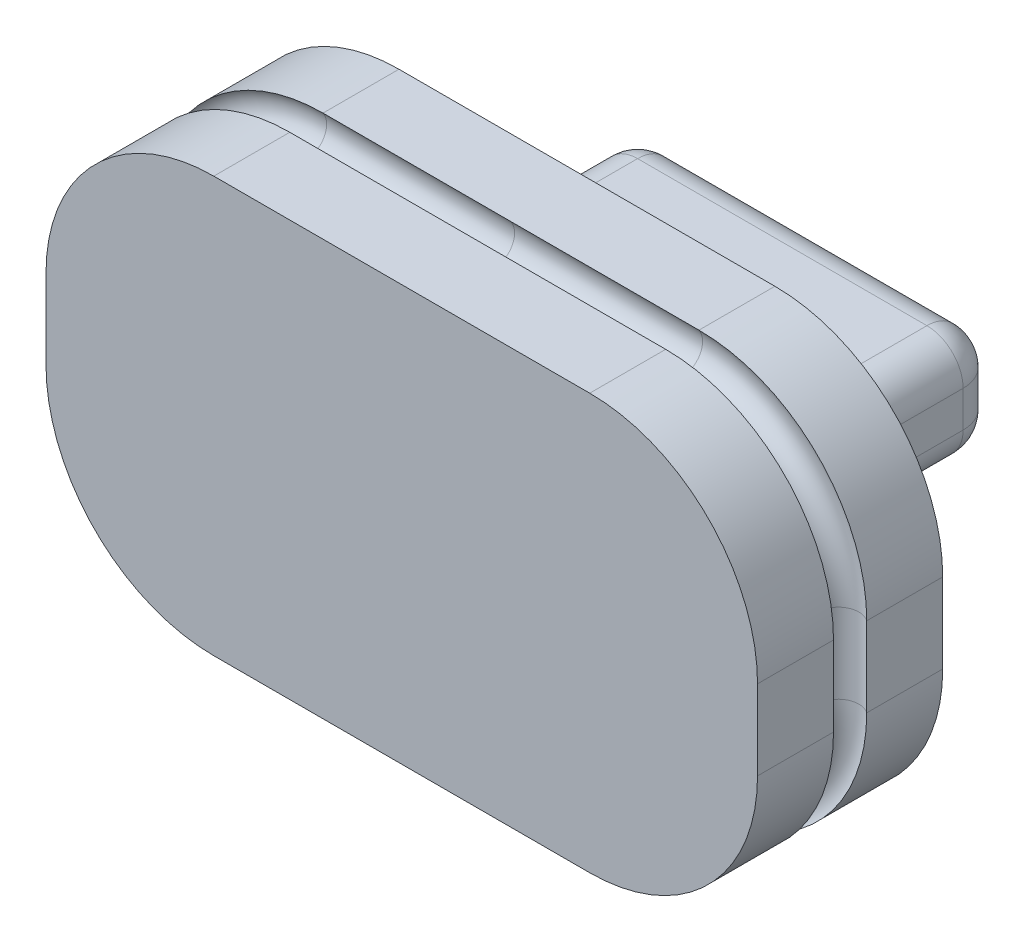
ISO-10303-21;
HEADER;
FILE_DESCRIPTION(('STEP AP214'),'2;1');
FILE_NAME('part.step','',(''),(''),'','','');
FILE_SCHEMA(('AUTOMOTIVE_DESIGN { 1 0 10303 214 1 1 1 1 }'));
ENDSEC;
DATA;
#1=APPLICATION_CONTEXT('core data for automotive mechanical design processes');
#2=APPLICATION_PROTOCOL_DEFINITION('international standard','automotive_design',2000,#1);
#3=PRODUCT_CONTEXT('',#1,'mechanical');
#4=PRODUCT('Part','Part','',(#3));
#5=PRODUCT_RELATED_PRODUCT_CATEGORY('part','',(#4));
#6=PRODUCT_DEFINITION_FORMATION('','',#4);
#7=PRODUCT_DEFINITION_CONTEXT('part definition',#1,'design');
#8=PRODUCT_DEFINITION('design','',#6,#7);
#9=PRODUCT_DEFINITION_SHAPE('','',#8);
#10=(LENGTH_UNIT() NAMED_UNIT(*) SI_UNIT(.MILLI.,.METRE.));
#11=(NAMED_UNIT(*) PLANE_ANGLE_UNIT() SI_UNIT($,.RADIAN.));
#12=(NAMED_UNIT(*) SI_UNIT($,.STERADIAN.) SOLID_ANGLE_UNIT());
#13=UNCERTAINTY_MEASURE_WITH_UNIT(LENGTH_MEASURE(1.E-05),#10,'distance_accuracy_value','');
#14=(GEOMETRIC_REPRESENTATION_CONTEXT(3) GLOBAL_UNCERTAINTY_ASSIGNED_CONTEXT((#13)) GLOBAL_UNIT_ASSIGNED_CONTEXT((#10,
#11,#12)) REPRESENTATION_CONTEXT('',''));
#15=CARTESIAN_POINT('',(0.,0.,0.));
#16=DIRECTION('',(0.,0.,1.));
#17=DIRECTION('',(1.,0.,0.));
#18=AXIS2_PLACEMENT_3D('',#15,#16,#17);
#19=CARTESIAN_POINT('',(-243.375083311208,0.,8.128));
#20=DIRECTION('',(-1.,0.,0.));
#21=DIRECTION('',(0.,0.,1.));
#22=AXIS2_PLACEMENT_3D('',#19,#20,#21);
#23=PLANE('',#22);
#24=DIRECTION('',(0.,-1.,0.));
#25=VECTOR('',#24,1.);
#26=CARTESIAN_POINT('',(-243.375083311208,1536.49490135246,3.33444054388972));
#27=LINE('',#26,#25);
#28=CARTESIAN_POINT('',(-243.375083311207,1536.49490135246,3.33444054388899));
#29=VERTEX_POINT('',#28);
#30=CARTESIAN_POINT('',(-243.375083311208,1532.99490135246,3.33444054388959));
#31=VERTEX_POINT('',#30);
#32=EDGE_CURVE('E11',#29,#31,#27,.T.);
#33=ORIENTED_EDGE('',*,*,#32,.F.);
#34=DIRECTION('',(0.,0.,-1.));
#35=VECTOR('',#34,1.);
#36=CARTESIAN_POINT('',(-243.375083311208,1536.49490135246,8.128));
#37=LINE('',#36,#35);
#38=CARTESIAN_POINT('',(-243.375083311208,1536.49490135246,0.));
#39=VERTEX_POINT('',#38);
#40=EDGE_CURVE('E230',#29,#39,#37,.T.);
#41=ORIENTED_EDGE('',*,*,#40,.T.);
#42=DIRECTION('',(0.,1.,0.));
#43=VECTOR('',#42,1.);
#44=CARTESIAN_POINT('',(-243.375083311208,0.,0.));
#45=LINE('',#44,#43);
#46=CARTESIAN_POINT('',(-243.375083311208,1532.99490135246,0.));
#47=VERTEX_POINT('',#46);
#48=EDGE_CURVE('E380',#47,#39,#45,.T.);
#49=ORIENTED_EDGE('',*,*,#48,.F.);
#50=DIRECTION('',(0.,0.,-1.));
#51=VECTOR('',#50,1.);
#52=CARTESIAN_POINT('',(-243.375083311208,1532.99490135246,8.128));
#53=LINE('',#52,#51);
#54=EDGE_CURVE('E232',#31,#47,#53,.T.);
#55=ORIENTED_EDGE('',*,*,#54,.F.);
#56=EDGE_LOOP('',(#33,#41,#49,#55));
#57=FACE_BOUND('',#56,.T.);
#58=ADVANCED_FACE('F35',(#57),#23,.T.);
#59=CARTESIAN_POINT('',(0.,1525.62990135246,8.128));
#60=DIRECTION('',(0.,-1.,0.));
#61=DIRECTION('',(0.,0.,-1.));
#62=AXIS2_PLACEMENT_3D('',#59,#60,#61);
#63=PLANE('',#62);
#64=DIRECTION('',(1.,0.,0.));
#65=VECTOR('',#64,1.);
#66=CARTESIAN_POINT('',(-236.010083311208,1525.62990135246,3.33444054388964));
#67=LINE('',#66,#65);
#68=CARTESIAN_POINT('',(-236.010083311208,1525.62990135246,3.33444054388964));
#69=VERTEX_POINT('',#68);
#70=CARTESIAN_POINT('',(-219.510083311208,1525.62990135246,3.3344405438896));
#71=VERTEX_POINT('',#70);
#72=EDGE_CURVE('E337',#69,#71,#67,.T.);
#73=ORIENTED_EDGE('',*,*,#72,.F.);
#74=DIRECTION('',(0.,0.,-1.));
#75=VECTOR('',#74,1.);
#76=CARTESIAN_POINT('',(-236.010083311208,1525.62990135246,8.128));
#77=LINE('',#76,#75);
#78=CARTESIAN_POINT('',(-236.010083311208,1525.62990135246,0.));
#79=VERTEX_POINT('',#78);
#80=EDGE_CURVE('E266',#69,#79,#77,.T.);
#81=ORIENTED_EDGE('',*,*,#80,.T.);
#82=DIRECTION('',(-1.,0.,0.));
#83=VECTOR('',#82,1.);
#84=CARTESIAN_POINT('',(0.,1525.62990135246,0.));
#85=LINE('',#84,#83);
#86=CARTESIAN_POINT('',(-219.510083311208,1525.62990135246,0.));
#87=VERTEX_POINT('',#86);
#88=EDGE_CURVE('E371',#87,#79,#85,.T.);
#89=ORIENTED_EDGE('',*,*,#88,.F.);
#90=DIRECTION('',(0.,0.,-1.));
#91=VECTOR('',#90,1.);
#92=CARTESIAN_POINT('',(-219.510083311208,1525.62990135246,8.128));
#93=LINE('',#92,#91);
#94=EDGE_CURVE('E262',#71,#87,#93,.T.);
#95=ORIENTED_EDGE('',*,*,#94,.F.);
#96=EDGE_LOOP('',(#73,#81,#89,#95));
#97=FACE_BOUND('',#96,.T.);
#98=ADVANCED_FACE('F369',(#97),#63,.T.);
#99=CARTESIAN_POINT('',(-212.14508331122,1.68234540037964E-12,8.128));
#100=DIRECTION('',(1.,0.,0.));
#101=DIRECTION('',(0.,1.,0.));
#102=AXIS2_PLACEMENT_3D('',#99,#100,#101);
#103=PLANE('',#102);
#104=DIRECTION('',(0.,1.,0.));
#105=VECTOR('',#104,1.);
#106=CARTESIAN_POINT('',(-212.145083311208,1532.99490135246,3.33444054388962));
#107=LINE('',#106,#105);
#108=CARTESIAN_POINT('',(-212.145083311208,1532.99490135246,3.33444054388962));
#109=VERTEX_POINT('',#108);
#110=CARTESIAN_POINT('',(-212.145083311208,1536.49490135246,3.33444054388967));
#111=VERTEX_POINT('',#110);
#112=EDGE_CURVE('E333',#109,#111,#107,.T.);
#113=ORIENTED_EDGE('',*,*,#112,.F.);
#114=DIRECTION('',(0.,0.,-1.));
#115=VECTOR('',#114,1.);
#116=CARTESIAN_POINT('',(-212.145083311208,1532.99490135246,8.128));
#117=LINE('',#116,#115);
#118=CARTESIAN_POINT('',(-212.145083311208,1532.99490135246,0.));
#119=VERTEX_POINT('',#118);
#120=EDGE_CURVE('E258',#109,#119,#117,.T.);
#121=ORIENTED_EDGE('',*,*,#120,.T.);
#122=DIRECTION('',(0.,-1.,0.));
#123=VECTOR('',#122,1.);
#124=CARTESIAN_POINT('',(-212.14508331122,1.68234540037964E-12,0.));
#125=LINE('',#124,#123);
#126=CARTESIAN_POINT('',(-212.145083311208,1536.49490135246,0.));
#127=VERTEX_POINT('',#126);
#128=EDGE_CURVE('E378',#127,#119,#125,.T.);
#129=ORIENTED_EDGE('',*,*,#128,.F.);
#130=DIRECTION('',(0.,0.,-1.));
#131=VECTOR('',#130,1.);
#132=CARTESIAN_POINT('',(-212.145083311208,1536.49490135246,8.128));
#133=LINE('',#132,#131);
#134=EDGE_CURVE('E254',#111,#127,#133,.T.);
#135=ORIENTED_EDGE('',*,*,#134,.F.);
#136=EDGE_LOOP('',(#113,#121,#129,#135));
#137=FACE_BOUND('',#136,.T.);
#138=ADVANCED_FACE('F607',(#137),#103,.T.);
#139=CARTESIAN_POINT('',(0.,1543.85990135246,8.128));
#140=DIRECTION('',(0.,1.,0.));
#141=DIRECTION('',(0.,0.,1.));
#142=AXIS2_PLACEMENT_3D('',#139,#140,#141);
#143=PLANE('',#142);
#144=DIRECTION('',(-1.,0.,0.));
#145=VECTOR('',#144,1.);
#146=CARTESIAN_POINT('',(-219.510083311208,1543.85990135246,3.33444054388964));
#147=LINE('',#146,#145);
#148=CARTESIAN_POINT('',(-219.510083311208,1543.85990135246,3.33444054388964));
#149=VERTEX_POINT('',#148);
#150=CARTESIAN_POINT('',(-227.760083311208,1543.85990135246,3.33444054388964));
#151=VERTEX_POINT('',#150);
#152=EDGE_CURVE('E329',#149,#151,#147,.T.);
#153=ORIENTED_EDGE('',*,*,#152,.F.);
#154=DIRECTION('',(0.,0.,-1.));
#155=VECTOR('',#154,1.);
#156=CARTESIAN_POINT('',(-219.510083311208,1543.85990135246,8.128));
#157=LINE('',#156,#155);
#158=CARTESIAN_POINT('',(-219.510083311208,1543.85990135246,0.));
#159=VERTEX_POINT('',#158);
#160=EDGE_CURVE('E250',#149,#159,#157,.T.);
#161=ORIENTED_EDGE('',*,*,#160,.T.);
#162=DIRECTION('',(1.,0.,0.));
#163=VECTOR('',#162,1.);
#164=CARTESIAN_POINT('',(0.,1543.85990135246,0.));
#165=LINE('',#164,#163);
#166=CARTESIAN_POINT('',(-236.010083311208,1543.85990135246,0.));
#167=VERTEX_POINT('',#166);
#168=EDGE_CURVE('E388',#167,#159,#165,.T.);
#169=ORIENTED_EDGE('',*,*,#168,.F.);
#170=DIRECTION('',(0.,0.,-1.));
#171=VECTOR('',#170,1.);
#172=CARTESIAN_POINT('',(-236.010083311208,1543.85990135246,8.128));
#173=LINE('',#172,#171);
#174=CARTESIAN_POINT('',(-236.010083311208,1543.85990135246,3.33444054388899));
#175=VERTEX_POINT('',#174);
#176=EDGE_CURVE('E241',#175,#167,#173,.T.);
#177=ORIENTED_EDGE('',*,*,#176,.F.);
#178=DIRECTION('',(-1.,0.,0.));
#179=VECTOR('',#178,1.);
#180=CARTESIAN_POINT('',(-227.760083311208,1543.85990135246,3.33444054388964));
#181=LINE('',#180,#179);
#182=EDGE_CURVE('E327',#151,#175,#181,.T.);
#183=ORIENTED_EDGE('',*,*,#182,.F.);
#184=EDGE_LOOP('',(#153,#161,#169,#177,#183));
#185=FACE_BOUND('',#184,.T.);
#186=ADVANCED_FACE('F526',(#185),#143,.T.);
#187=CARTESIAN_POINT('',(0.,0.,0.));
#188=DIRECTION('',(0.,0.,1.));
#189=DIRECTION('',(1.,0.,0.));
#190=AXIS2_PLACEMENT_3D('',#187,#188,#189);
#191=PLANE('',#190);
#192=ORIENTED_EDGE('',*,*,#48,.T.);
#193=CARTESIAN_POINT('',(-236.010083311208,1536.49490135246,0.));
#194=DIRECTION('',(0.,0.,1.));
#195=DIRECTION('',(1.,0.,0.));
#196=AXIS2_PLACEMENT_3D('',#193,#194,#195);
#197=CIRCLE('',#196,7.36500000000002);
#198=EDGE_CURVE('E235',#167,#39,#197,.T.);
#199=ORIENTED_EDGE('',*,*,#198,.F.);
#200=ORIENTED_EDGE('',*,*,#168,.T.);
#201=CARTESIAN_POINT('',(-219.510083311208,1536.49490135246,0.));
#202=DIRECTION('',(0.,0.,1.));
#203=DIRECTION('',(1.,0.,0.));
#204=AXIS2_PLACEMENT_3D('',#201,#202,#203);
#205=CIRCLE('',#204,7.36500000000002);
#206=EDGE_CURVE('E386',#127,#159,#205,.T.);
#207=ORIENTED_EDGE('',*,*,#206,.F.);
#208=ORIENTED_EDGE('',*,*,#128,.T.);
#209=CARTESIAN_POINT('',(-219.510083311208,1532.99490135246,0.));
#210=DIRECTION('',(0.,0.,1.));
#211=DIRECTION('',(1.,0.,0.));
#212=AXIS2_PLACEMENT_3D('',#209,#210,#211);
#213=CIRCLE('',#212,7.36500000000001);
#214=EDGE_CURVE('E375',#87,#119,#213,.T.);
#215=ORIENTED_EDGE('',*,*,#214,.F.);
#216=ORIENTED_EDGE('',*,*,#88,.T.);
#217=CARTESIAN_POINT('',(-236.010083311208,1532.99490135246,0.));
#218=DIRECTION('',(0.,0.,1.));
#219=DIRECTION('',(1.,0.,0.));
#220=AXIS2_PLACEMENT_3D('',#217,#218,#219);
#221=CIRCLE('',#220,7.36500000000002);
#222=EDGE_CURVE('E376',#47,#79,#221,.T.);
#223=ORIENTED_EDGE('',*,*,#222,.F.);
#224=EDGE_LOOP('',(#192,#199,#200,#207,#208,#215,#216,#223));
#225=FACE_BOUND('',#224,.T.);
#226=CARTESIAN_POINT('',(-221.410083311208,1535.53865135246,0.));
#227=DIRECTION('',(0.,0.,-1.));
#228=DIRECTION('',(-1.,0.,0.));
#229=AXIS2_PLACEMENT_3D('',#226,#227,#228);
#230=CIRCLE('',#229,1.58750000000002);
#231=CARTESIAN_POINT('',(-221.410083311208,1537.12615135246,0.));
#232=VERTEX_POINT('',#231);
#233=CARTESIAN_POINT('',(-219.822583311208,1535.53865135246,0.));
#234=VERTEX_POINT('',#233);
#235=EDGE_CURVE('E320',#232,#234,#230,.T.);
#236=ORIENTED_EDGE('',*,*,#235,.F.);
#237=DIRECTION('',(1.,0.,0.));
#238=VECTOR('',#237,1.);
#239=CARTESIAN_POINT('',(-234.110083311208,1537.12615135246,0.));
#240=LINE('',#239,#238);
#241=CARTESIAN_POINT('',(-234.110083311208,1537.12615135246,0.));
#242=VERTEX_POINT('',#241);
#243=EDGE_CURVE('E436',#242,#232,#240,.T.);
#244=ORIENTED_EDGE('',*,*,#243,.F.);
#245=CARTESIAN_POINT('',(-234.110083311208,1535.53865135246,0.));
#246=DIRECTION('',(0.,0.,-1.));
#247=DIRECTION('',(-1.,0.,0.));
#248=AXIS2_PLACEMENT_3D('',#245,#246,#247);
#249=CIRCLE('',#248,1.58750000000002);
#250=CARTESIAN_POINT('',(-235.697583311208,1535.53865135246,0.));
#251=VERTEX_POINT('',#250);
#252=EDGE_CURVE('E439',#251,#242,#249,.T.);
#253=ORIENTED_EDGE('',*,*,#252,.F.);
#254=DIRECTION('',(0.,1.,0.));
#255=VECTOR('',#254,1.);
#256=CARTESIAN_POINT('',(-235.697583311208,1533.95115135246,0.));
#257=LINE('',#256,#255);
#258=CARTESIAN_POINT('',(-235.697583311208,1533.95115135246,0.));
#259=VERTEX_POINT('',#258);
#260=EDGE_CURVE('E442',#259,#251,#257,.T.);
#261=ORIENTED_EDGE('',*,*,#260,.F.);
#262=CARTESIAN_POINT('',(-234.110083311208,1533.95115135246,0.));
#263=DIRECTION('',(0.,0.,-1.));
#264=DIRECTION('',(-1.,0.,0.));
#265=AXIS2_PLACEMENT_3D('',#262,#263,#264);
#266=CIRCLE('',#265,1.58750000000002);
#267=CARTESIAN_POINT('',(-234.110083311208,1532.36365135246,0.));
#268=VERTEX_POINT('',#267);
#269=EDGE_CURVE('E445',#268,#259,#266,.T.);
#270=ORIENTED_EDGE('',*,*,#269,.F.);
#271=DIRECTION('',(-1.,0.,0.));
#272=VECTOR('',#271,1.);
#273=CARTESIAN_POINT('',(-234.110083311208,1532.36365135246,0.));
#274=LINE('',#273,#272);
#275=CARTESIAN_POINT('',(-221.410083311208,1532.36365135246,0.));
#276=VERTEX_POINT('',#275);
#277=EDGE_CURVE('E448',#276,#268,#274,.T.);
#278=ORIENTED_EDGE('',*,*,#277,.F.);
#279=CARTESIAN_POINT('',(-221.410083311208,1533.95115135246,0.));
#280=DIRECTION('',(0.,0.,-1.));
#281=DIRECTION('',(1.,0.,0.));
#282=AXIS2_PLACEMENT_3D('',#279,#280,#281);
#283=CIRCLE('',#282,1.58750000000002);
#284=CARTESIAN_POINT('',(-219.822583311208,1533.95115135246,0.));
#285=VERTEX_POINT('',#284);
#286=EDGE_CURVE('E451',#285,#276,#283,.T.);
#287=ORIENTED_EDGE('',*,*,#286,.F.);
#288=DIRECTION('',(0.,-1.,0.));
#289=VECTOR('',#288,1.);
#290=CARTESIAN_POINT('',(-219.822583311208,1533.95115135246,0.));
#291=LINE('',#290,#289);
#292=EDGE_CURVE('E453',#234,#285,#291,.T.);
#293=ORIENTED_EDGE('',*,*,#292,.F.);
#294=EDGE_LOOP('',(#236,#244,#253,#261,#270,#278,#287,#293));
#295=FACE_BOUND('',#294,.T.);
#296=ADVANCED_FACE('F528',(#225,#295),#191,.F.);
#297=CARTESIAN_POINT('',(-236.010083311208,1532.99490135246,8.128));
#298=DIRECTION('',(0.,0.,-1.));
#299=DIRECTION('',(-1.,0.,0.));
#300=AXIS2_PLACEMENT_3D('',#297,#298,#299);
#301=CYLINDRICAL_SURFACE('',#300,7.36500000000002);
#302=ORIENTED_EDGE('',*,*,#80,.F.);
#303=CARTESIAN_POINT('',(-236.010083311208,1532.99490135246,3.33444054388959));
#304=DIRECTION('',(0.,0.,1.));
#305=DIRECTION('',(1.,0.,0.));
#306=AXIS2_PLACEMENT_3D('',#303,#304,#305);
#307=CIRCLE('',#306,7.36500000000002);
#308=EDGE_CURVE('E459',#69,#31,#307,.F.);
#309=ORIENTED_EDGE('',*,*,#308,.T.);
#310=ORIENTED_EDGE('',*,*,#54,.T.);
#311=ORIENTED_EDGE('',*,*,#222,.T.);
#312=EDGE_LOOP('',(#302,#309,#310,#311));
#313=FACE_BOUND('',#312,.T.);
#314=ADVANCED_FACE('F531',(#313),#301,.T.);
#315=CARTESIAN_POINT('',(-219.510083311208,1532.99490135246,8.128));
#316=DIRECTION('',(0.,0.,-1.));
#317=DIRECTION('',(-1.,0.,0.));
#318=AXIS2_PLACEMENT_3D('',#315,#316,#317);
#319=CYLINDRICAL_SURFACE('',#318,7.36500000000001);
#320=ORIENTED_EDGE('',*,*,#120,.F.);
#321=CARTESIAN_POINT('',(-219.510083311208,1532.99490135246,3.3344405438896));
#322=DIRECTION('',(0.,0.,1.));
#323=DIRECTION('',(1.,0.,0.));
#324=AXIS2_PLACEMENT_3D('',#321,#322,#323);
#325=CIRCLE('',#324,7.36500000000001);
#326=EDGE_CURVE('E355',#109,#71,#325,.F.);
#327=ORIENTED_EDGE('',*,*,#326,.T.);
#328=ORIENTED_EDGE('',*,*,#94,.T.);
#329=ORIENTED_EDGE('',*,*,#214,.T.);
#330=EDGE_LOOP('',(#320,#327,#328,#329));
#331=FACE_BOUND('',#330,.T.);
#332=ADVANCED_FACE('F363',(#331),#319,.T.);
#333=CARTESIAN_POINT('',(-219.510083311208,1536.49490135246,8.128));
#334=DIRECTION('',(0.,0.,-1.));
#335=DIRECTION('',(-1.,0.,0.));
#336=AXIS2_PLACEMENT_3D('',#333,#334,#335);
#337=CYLINDRICAL_SURFACE('',#336,7.36500000000002);
#338=ORIENTED_EDGE('',*,*,#160,.F.);
#339=CARTESIAN_POINT('',(-219.510083311208,1536.49490135246,3.33444054388967));
#340=DIRECTION('',(0.,0.,1.));
#341=DIRECTION('',(1.,0.,0.));
#342=AXIS2_PLACEMENT_3D('',#339,#340,#341);
#343=CIRCLE('',#342,7.36500000000002);
#344=EDGE_CURVE('E465',#149,#111,#343,.F.);
#345=ORIENTED_EDGE('',*,*,#344,.T.);
#346=ORIENTED_EDGE('',*,*,#134,.T.);
#347=ORIENTED_EDGE('',*,*,#206,.T.);
#348=EDGE_LOOP('',(#338,#345,#346,#347));
#349=FACE_BOUND('',#348,.T.);
#350=ADVANCED_FACE('F599',(#349),#337,.T.);
#351=CARTESIAN_POINT('',(-236.010083311208,1536.49490135246,8.128));
#352=DIRECTION('',(0.,0.,-1.));
#353=DIRECTION('',(-1.,0.,0.));
#354=AXIS2_PLACEMENT_3D('',#351,#352,#353);
#355=CYLINDRICAL_SURFACE('',#354,7.36500000000002);
#356=ORIENTED_EDGE('',*,*,#40,.F.);
#357=CARTESIAN_POINT('',(-236.010083311208,1536.49490135246,3.33444054388899));
#358=DIRECTION('',(0.,0.,1.));
#359=DIRECTION('',(1.,0.,0.));
#360=AXIS2_PLACEMENT_3D('',#357,#358,#359);
#361=CIRCLE('',#360,7.36500000000002);
#362=EDGE_CURVE('E210',#29,#175,#361,.F.);
#363=ORIENTED_EDGE('',*,*,#362,.T.);
#364=ORIENTED_EDGE('',*,*,#176,.T.);
#365=ORIENTED_EDGE('',*,*,#198,.T.);
#366=EDGE_LOOP('',(#356,#363,#364,#365));
#367=FACE_BOUND('',#366,.T.);
#368=ADVANCED_FACE('F233',(#367),#355,.T.);
#369=CARTESIAN_POINT('',(-221.410083311208,1535.53865135246,-10.16));
#370=DIRECTION('',(0.,0.,1.));
#371=DIRECTION('',(1.,0.,0.));
#372=AXIS2_PLACEMENT_3D('',#369,#370,#371);
#373=CYLINDRICAL_SURFACE('',#372,1.58750000000002);
#374=DIRECTION('',(0.,0.,1.));
#375=VECTOR('',#374,1.);
#376=CARTESIAN_POINT('',(-219.822583311208,1535.53865135246,-10.16));
#377=LINE('',#376,#375);
#378=CARTESIAN_POINT('',(-219.822583311208,1535.53865135246,-8.5725));
#379=VERTEX_POINT('',#378);
#380=EDGE_CURVE('E401',#379,#234,#377,.T.);
#381=ORIENTED_EDGE('',*,*,#380,.F.);
#382=CARTESIAN_POINT('',(-221.410083311208,1535.53865135246,-8.5725));
#383=DIRECTION('',(0.,0.,1.));
#384=DIRECTION('',(1.,0.,0.));
#385=AXIS2_PLACEMENT_3D('',#382,#383,#384);
#386=CIRCLE('',#385,1.58750000000002);
#387=CARTESIAN_POINT('',(-221.410083311208,1537.12615135246,-8.5725));
#388=VERTEX_POINT('',#387);
#389=EDGE_CURVE('E216',#379,#388,#386,.T.);
#390=ORIENTED_EDGE('',*,*,#389,.T.);
#391=DIRECTION('',(0.,0.,1.));
#392=VECTOR('',#391,1.);
#393=CARTESIAN_POINT('',(-221.410083311208,1537.12615135246,-10.16));
#394=LINE('',#393,#392);
#395=EDGE_CURVE('E434',#388,#232,#394,.T.);
#396=ORIENTED_EDGE('',*,*,#395,.T.);
#397=ORIENTED_EDGE('',*,*,#235,.T.);
#398=EDGE_LOOP('',(#381,#390,#396,#397));
#399=FACE_BOUND('',#398,.T.);
#400=ADVANCED_FACE('F591',(#399),#373,.T.);
#401=CARTESIAN_POINT('',(-219.822583311208,1533.95115135246,-10.16));
#402=DIRECTION('',(-1.,0.,0.));
#403=DIRECTION('',(0.,0.,1.));
#404=AXIS2_PLACEMENT_3D('',#401,#402,#403);
#405=PLANE('',#404);
#406=DIRECTION('',(0.,0.,1.));
#407=VECTOR('',#406,1.);
#408=CARTESIAN_POINT('',(-219.822583311208,1533.95115135246,-10.16));
#409=LINE('',#408,#407);
#410=CARTESIAN_POINT('',(-219.822583311208,1533.95115135246,-8.5725));
#411=VERTEX_POINT('',#410);
#412=EDGE_CURVE('E414',#411,#285,#409,.T.);
#413=ORIENTED_EDGE('',*,*,#412,.F.);
#414=DIRECTION('',(0.,-1.,0.));
#415=VECTOR('',#414,1.);
#416=CARTESIAN_POINT('',(-219.822583311208,1535.53865135246,-8.5725));
#417=LINE('',#416,#415);
#418=EDGE_CURVE('E295',#411,#379,#417,.F.);
#419=ORIENTED_EDGE('',*,*,#418,.T.);
#420=ORIENTED_EDGE('',*,*,#380,.T.);
#421=ORIENTED_EDGE('',*,*,#292,.T.);
#422=EDGE_LOOP('',(#413,#419,#420,#421));
#423=FACE_BOUND('',#422,.T.);
#424=ADVANCED_FACE('F579',(#423),#405,.F.);
#425=CARTESIAN_POINT('',(-221.410083311208,1533.95115135246,-10.16));
#426=DIRECTION('',(0.,0.,1.));
#427=DIRECTION('',(1.,0.,0.));
#428=AXIS2_PLACEMENT_3D('',#425,#426,#427);
#429=CYLINDRICAL_SURFACE('',#428,1.58750000000002);
#430=DIRECTION('',(0.,0.,1.));
#431=VECTOR('',#430,1.);
#432=CARTESIAN_POINT('',(-221.410083311208,1532.36365135246,-10.16));
#433=LINE('',#432,#431);
#434=CARTESIAN_POINT('',(-221.410083311208,1532.36365135246,-8.5725));
#435=VERTEX_POINT('',#434);
#436=EDGE_CURVE('E419',#435,#276,#433,.T.);
#437=ORIENTED_EDGE('',*,*,#436,.F.);
#438=CARTESIAN_POINT('',(-221.410083311208,1533.95115135246,-8.5725));
#439=DIRECTION('',(0.,0.,1.));
#440=DIRECTION('',(1.,0.,0.));
#441=AXIS2_PLACEMENT_3D('',#438,#439,#440);
#442=CIRCLE('',#441,1.58750000000002);
#443=EDGE_CURVE('E293',#435,#411,#442,.T.);
#444=ORIENTED_EDGE('',*,*,#443,.T.);
#445=ORIENTED_EDGE('',*,*,#412,.T.);
#446=ORIENTED_EDGE('',*,*,#286,.T.);
#447=EDGE_LOOP('',(#437,#444,#445,#446));
#448=FACE_BOUND('',#447,.T.);
#449=ADVANCED_FACE('F578',(#448),#429,.T.);
#450=CARTESIAN_POINT('',(-234.110083311208,1532.36365135246,-10.16));
#451=DIRECTION('',(0.,1.,0.));
#452=DIRECTION('',(0.,0.,1.));
#453=AXIS2_PLACEMENT_3D('',#450,#451,#452);
#454=PLANE('',#453);
#455=DIRECTION('',(0.,0.,1.));
#456=VECTOR('',#455,1.);
#457=CARTESIAN_POINT('',(-234.110083311208,1532.36365135246,-10.16));
#458=LINE('',#457,#456);
#459=CARTESIAN_POINT('',(-234.110083311208,1532.36365135246,-8.5725));
#460=VERTEX_POINT('',#459);
#461=EDGE_CURVE('E424',#460,#268,#458,.T.);
#462=ORIENTED_EDGE('',*,*,#461,.F.);
#463=DIRECTION('',(-1.,0.,0.));
#464=VECTOR('',#463,1.);
#465=CARTESIAN_POINT('',(-221.410083311208,1532.36365135246,-8.5725));
#466=LINE('',#465,#464);
#467=EDGE_CURVE('E291',#460,#435,#466,.F.);
#468=ORIENTED_EDGE('',*,*,#467,.T.);
#469=ORIENTED_EDGE('',*,*,#436,.T.);
#470=ORIENTED_EDGE('',*,*,#277,.T.);
#471=EDGE_LOOP('',(#462,#468,#469,#470));
#472=FACE_BOUND('',#471,.T.);
#473=ADVANCED_FACE('F576',(#472),#454,.F.);
#474=CARTESIAN_POINT('',(-234.110083311208,1533.95115135246,-10.16));
#475=DIRECTION('',(0.,0.,1.));
#476=DIRECTION('',(1.,0.,0.));
#477=AXIS2_PLACEMENT_3D('',#474,#475,#476);
#478=CYLINDRICAL_SURFACE('',#477,1.58750000000002);
#479=DIRECTION('',(0.,0.,1.));
#480=VECTOR('',#479,1.);
#481=CARTESIAN_POINT('',(-235.697583311208,1533.95115135246,-10.16));
#482=LINE('',#481,#480);
#483=CARTESIAN_POINT('',(-235.697583311208,1533.95115135246,-8.5725));
#484=VERTEX_POINT('',#483);
#485=EDGE_CURVE('E428',#484,#259,#482,.T.);
#486=ORIENTED_EDGE('',*,*,#485,.F.);
#487=CARTESIAN_POINT('',(-234.110083311208,1533.95115135246,-8.5725));
#488=DIRECTION('',(0.,0.,1.));
#489=DIRECTION('',(1.,0.,0.));
#490=AXIS2_PLACEMENT_3D('',#487,#488,#489);
#491=CIRCLE('',#490,1.58750000000002);
#492=EDGE_CURVE('E289',#484,#460,#491,.T.);
#493=ORIENTED_EDGE('',*,*,#492,.T.);
#494=ORIENTED_EDGE('',*,*,#461,.T.);
#495=ORIENTED_EDGE('',*,*,#269,.T.);
#496=EDGE_LOOP('',(#486,#493,#494,#495));
#497=FACE_BOUND('',#496,.T.);
#498=ADVANCED_FACE('F554',(#497),#478,.T.);
#499=CARTESIAN_POINT('',(-235.697583311208,1533.95115135246,-10.16));
#500=DIRECTION('',(1.,0.,0.));
#501=DIRECTION('',(0.,0.,-1.));
#502=AXIS2_PLACEMENT_3D('',#499,#500,#501);
#503=PLANE('',#502);
#504=DIRECTION('',(0.,0.,1.));
#505=VECTOR('',#504,1.);
#506=CARTESIAN_POINT('',(-235.697583311208,1535.53865135246,-10.16));
#507=LINE('',#506,#505);
#508=CARTESIAN_POINT('',(-235.697583311208,1535.53865135246,-8.5725));
#509=VERTEX_POINT('',#508);
#510=EDGE_CURVE('E430',#509,#251,#507,.T.);
#511=ORIENTED_EDGE('',*,*,#510,.F.);
#512=DIRECTION('',(0.,1.,0.));
#513=VECTOR('',#512,1.);
#514=CARTESIAN_POINT('',(-235.697583311208,1533.95115135246,-8.5725));
#515=LINE('',#514,#513);
#516=EDGE_CURVE('E287',#509,#484,#515,.F.);
#517=ORIENTED_EDGE('',*,*,#516,.T.);
#518=ORIENTED_EDGE('',*,*,#485,.T.);
#519=ORIENTED_EDGE('',*,*,#260,.T.);
#520=EDGE_LOOP('',(#511,#517,#518,#519));
#521=FACE_BOUND('',#520,.T.);
#522=ADVANCED_FACE('F549',(#521),#503,.F.);
#523=CARTESIAN_POINT('',(-234.110083311208,1535.53865135246,-10.16));
#524=DIRECTION('',(0.,0.,1.));
#525=DIRECTION('',(1.,0.,0.));
#526=AXIS2_PLACEMENT_3D('',#523,#524,#525);
#527=CYLINDRICAL_SURFACE('',#526,1.58750000000002);
#528=DIRECTION('',(0.,0.,1.));
#529=VECTOR('',#528,1.);
#530=CARTESIAN_POINT('',(-234.110083311208,1537.12615135246,-10.16));
#531=LINE('',#530,#529);
#532=CARTESIAN_POINT('',(-234.110083311208,1537.12615135246,-8.5725));
#533=VERTEX_POINT('',#532);
#534=EDGE_CURVE('E432',#533,#242,#531,.T.);
#535=ORIENTED_EDGE('',*,*,#534,.F.);
#536=CARTESIAN_POINT('',(-234.110083311208,1535.53865135246,-8.5725));
#537=DIRECTION('',(0.,0.,1.));
#538=DIRECTION('',(1.,0.,0.));
#539=AXIS2_PLACEMENT_3D('',#536,#537,#538);
#540=CIRCLE('',#539,1.58750000000002);
#541=EDGE_CURVE('E285',#533,#509,#540,.T.);
#542=ORIENTED_EDGE('',*,*,#541,.T.);
#543=ORIENTED_EDGE('',*,*,#510,.T.);
#544=ORIENTED_EDGE('',*,*,#252,.T.);
#545=EDGE_LOOP('',(#535,#542,#543,#544));
#546=FACE_BOUND('',#545,.T.);
#547=ADVANCED_FACE('F543',(#546),#527,.T.);
#548=CARTESIAN_POINT('',(-234.110083311208,1537.12615135246,-10.16));
#549=DIRECTION('',(0.,-1.,0.));
#550=DIRECTION('',(0.,0.,-1.));
#551=AXIS2_PLACEMENT_3D('',#548,#549,#550);
#552=PLANE('',#551);
#553=ORIENTED_EDGE('',*,*,#395,.F.);
#554=DIRECTION('',(1.,0.,0.));
#555=VECTOR('',#554,1.);
#556=CARTESIAN_POINT('',(-234.110083311208,1537.12615135246,-8.5725));
#557=LINE('',#556,#555);
#558=EDGE_CURVE('E282',#388,#533,#557,.F.);
#559=ORIENTED_EDGE('',*,*,#558,.T.);
#560=ORIENTED_EDGE('',*,*,#534,.T.);
#561=ORIENTED_EDGE('',*,*,#243,.T.);
#562=EDGE_LOOP('',(#553,#559,#560,#561));
#563=FACE_BOUND('',#562,.T.);
#564=ADVANCED_FACE('F539',(#563),#552,.F.);
#565=CARTESIAN_POINT('',(-221.410083311208,1535.53865135246,-10.16));
#566=DIRECTION('',(0.,0.,-1.));
#567=DIRECTION('',(-1.,0.,0.));
#568=AXIS2_PLACEMENT_3D('',#565,#566,#567);
#569=PLANE('',#568);
#570=DIRECTION('',(0.,1.,0.));
#571=VECTOR('',#570,1.);
#572=CARTESIAN_POINT('',(-234.110083311208,1535.53865135246,-10.16));
#573=LINE('',#572,#571);
#574=CARTESIAN_POINT('',(-234.110083311208,1533.95115135246,-10.16));
#575=VERTEX_POINT('',#574);
#576=CARTESIAN_POINT('',(-234.110083311208,1535.53865135246,-10.16));
#577=VERTEX_POINT('',#576);
#578=EDGE_CURVE('E277',#575,#577,#573,.T.);
#579=ORIENTED_EDGE('',*,*,#578,.T.);
#580=DIRECTION('',(1.,0.,0.));
#581=VECTOR('',#580,1.);
#582=CARTESIAN_POINT('',(-221.410083311208,1535.53865135246,-10.16));
#583=LINE('',#582,#581);
#584=CARTESIAN_POINT('',(-221.410083311208,1535.53865135246,-10.16));
#585=VERTEX_POINT('',#584);
#586=EDGE_CURVE('E279',#577,#585,#583,.T.);
#587=ORIENTED_EDGE('',*,*,#586,.T.);
#588=DIRECTION('',(0.,-1.,0.));
#589=VECTOR('',#588,1.);
#590=CARTESIAN_POINT('',(-221.410083311208,1533.95115135246,-10.16));
#591=LINE('',#590,#589);
#592=CARTESIAN_POINT('',(-221.410083311208,1533.95115135246,-10.16));
#593=VERTEX_POINT('',#592);
#594=EDGE_CURVE('E273',#585,#593,#591,.T.);
#595=ORIENTED_EDGE('',*,*,#594,.T.);
#596=DIRECTION('',(-1.,0.,0.));
#597=VECTOR('',#596,1.);
#598=CARTESIAN_POINT('',(-234.110083311208,1533.95115135246,-10.16));
#599=LINE('',#598,#597);
#600=EDGE_CURVE('E275',#593,#575,#599,.T.);
#601=ORIENTED_EDGE('',*,*,#600,.T.);
#602=EDGE_LOOP('',(#579,#587,#595,#601));
#603=FACE_BOUND('',#602,.T.);
#604=ADVANCED_FACE('F566',(#603),#569,.T.);
#605=CARTESIAN_POINT('',(-221.410083311208,1533.95115135246,-8.5725));
#606=DIRECTION('',(1.,0.,0.));
#607=DIRECTION('',(0.,0.,-1.));
#608=AXIS2_PLACEMENT_3D('',#605,#606,#607);
#609=CYLINDRICAL_SURFACE('',#608,1.5875);
#610=CARTESIAN_POINT('',(-221.410083311208,1533.95115135246,-8.5725));
#611=DIRECTION('',(1.,0.,0.));
#612=DIRECTION('',(0.,0.,-1.));
#613=AXIS2_PLACEMENT_3D('',#610,#611,#612);
#614=CIRCLE('',#613,1.5875);
#615=EDGE_CURVE('E315',#435,#593,#614,.T.);
#616=ORIENTED_EDGE('',*,*,#615,.F.);
#617=ORIENTED_EDGE('',*,*,#467,.F.);
#618=CARTESIAN_POINT('',(-234.110083311208,1533.95115135246,-8.5725));
#619=DIRECTION('',(-1.,0.,0.));
#620=DIRECTION('',(0.,0.,1.));
#621=AXIS2_PLACEMENT_3D('',#618,#619,#620);
#622=CIRCLE('',#621,1.5875);
#623=EDGE_CURVE('E318',#575,#460,#622,.T.);
#624=ORIENTED_EDGE('',*,*,#623,.F.);
#625=ORIENTED_EDGE('',*,*,#600,.F.);
#626=EDGE_LOOP('',(#616,#617,#624,#625));
#627=FACE_BOUND('',#626,.T.);
#628=ADVANCED_FACE('F37',(#627),#609,.T.);
#629=CARTESIAN_POINT('',(-234.110083311208,1533.95115135246,-8.5725));
#630=DIRECTION('',(0.,0.,-1.));
#631=DIRECTION('',(-1.,0.,0.));
#632=AXIS2_PLACEMENT_3D('',#629,#630,#631);
#633=SPHERICAL_SURFACE('',#632,1.5875);
#634=ORIENTED_EDGE('',*,*,#623,.T.);
#635=ORIENTED_EDGE('',*,*,#492,.F.);
#636=CARTESIAN_POINT('',(-234.110083311208,1533.95115135246,-8.5725));
#637=DIRECTION('',(0.,1.,0.));
#638=DIRECTION('',(0.,0.,1.));
#639=AXIS2_PLACEMENT_3D('',#636,#637,#638);
#640=CIRCLE('',#639,1.5875);
#641=EDGE_CURVE('E312',#575,#484,#640,.T.);
#642=ORIENTED_EDGE('',*,*,#641,.F.);
#643=EDGE_LOOP('',(#634,#635,#642));
#644=FACE_BOUND('',#643,.T.);
#645=ADVANCED_FACE('F558',(#644),#633,.T.);
#646=CARTESIAN_POINT('',(-221.410083311208,1533.95115135246,-8.5725));
#647=DIRECTION('',(0.,0.,-1.));
#648=DIRECTION('',(-1.,0.,0.));
#649=AXIS2_PLACEMENT_3D('',#646,#647,#648);
#650=SPHERICAL_SURFACE('',#649,1.5875);
#651=ORIENTED_EDGE('',*,*,#443,.F.);
#652=ORIENTED_EDGE('',*,*,#615,.T.);
#653=CARTESIAN_POINT('',(-221.410083311208,1533.95115135246,-8.5725));
#654=DIRECTION('',(0.,1.,0.));
#655=DIRECTION('',(0.,0.,1.));
#656=AXIS2_PLACEMENT_3D('',#653,#654,#655);
#657=CIRCLE('',#656,1.5875);
#658=EDGE_CURVE('E309',#411,#593,#657,.T.);
#659=ORIENTED_EDGE('',*,*,#658,.F.);
#660=EDGE_LOOP('',(#651,#652,#659));
#661=FACE_BOUND('',#660,.T.);
#662=ADVANCED_FACE('F583',(#661),#650,.T.);
#663=CARTESIAN_POINT('',(-234.110083311208,1535.53865135246,-8.5725));
#664=DIRECTION('',(0.,-1.,0.));
#665=DIRECTION('',(0.,0.,-1.));
#666=AXIS2_PLACEMENT_3D('',#663,#664,#665);
#667=CYLINDRICAL_SURFACE('',#666,1.5875);
#668=ORIENTED_EDGE('',*,*,#641,.T.);
#669=ORIENTED_EDGE('',*,*,#516,.F.);
#670=CARTESIAN_POINT('',(-234.110083311208,1535.53865135246,-8.5725));
#671=DIRECTION('',(0.,1.,0.));
#672=DIRECTION('',(0.,0.,1.));
#673=AXIS2_PLACEMENT_3D('',#670,#671,#672);
#674=CIRCLE('',#673,1.5875);
#675=EDGE_CURVE('E306',#577,#509,#674,.T.);
#676=ORIENTED_EDGE('',*,*,#675,.F.);
#677=ORIENTED_EDGE('',*,*,#578,.F.);
#678=EDGE_LOOP('',(#668,#669,#676,#677));
#679=FACE_BOUND('',#678,.T.);
#680=ADVANCED_FACE('F562',(#679),#667,.T.);
#681=CARTESIAN_POINT('',(-221.410083311208,1535.53865135246,-8.5725));
#682=DIRECTION('',(0.,1.,0.));
#683=DIRECTION('',(0.,0.,1.));
#684=AXIS2_PLACEMENT_3D('',#681,#682,#683);
#685=CYLINDRICAL_SURFACE('',#684,1.5875);
#686=ORIENTED_EDGE('',*,*,#658,.T.);
#687=ORIENTED_EDGE('',*,*,#594,.F.);
#688=CARTESIAN_POINT('',(-221.410083311208,1535.53865135246,-8.5725));
#689=DIRECTION('',(0.,1.,0.));
#690=DIRECTION('',(0.,0.,1.));
#691=AXIS2_PLACEMENT_3D('',#688,#689,#690);
#692=CIRCLE('',#691,1.5875);
#693=EDGE_CURVE('E303',#379,#585,#692,.T.);
#694=ORIENTED_EDGE('',*,*,#693,.F.);
#695=ORIENTED_EDGE('',*,*,#418,.F.);
#696=EDGE_LOOP('',(#686,#687,#694,#695));
#697=FACE_BOUND('',#696,.T.);
#698=ADVANCED_FACE('F586',(#697),#685,.T.);
#699=CARTESIAN_POINT('',(-234.110083311208,1535.53865135246,-8.5725));
#700=DIRECTION('',(0.,0.,-1.));
#701=DIRECTION('',(-1.,0.,0.));
#702=AXIS2_PLACEMENT_3D('',#699,#700,#701);
#703=SPHERICAL_SURFACE('',#702,1.5875);
#704=ORIENTED_EDGE('',*,*,#675,.T.);
#705=ORIENTED_EDGE('',*,*,#541,.F.);
#706=CARTESIAN_POINT('',(-234.110083311208,1535.53865135246,-8.5725));
#707=DIRECTION('',(1.,0.,0.));
#708=DIRECTION('',(0.,0.,-1.));
#709=AXIS2_PLACEMENT_3D('',#706,#707,#708);
#710=CIRCLE('',#709,1.5875);
#711=EDGE_CURVE('E300',#577,#533,#710,.T.);
#712=ORIENTED_EDGE('',*,*,#711,.F.);
#713=EDGE_LOOP('',(#704,#705,#712));
#714=FACE_BOUND('',#713,.T.);
#715=ADVANCED_FACE('F749',(#714),#703,.T.);
#716=CARTESIAN_POINT('',(-221.410083311208,1535.53865135246,-8.5725));
#717=DIRECTION('',(0.,0.,-1.));
#718=DIRECTION('',(-1.,0.,0.));
#719=AXIS2_PLACEMENT_3D('',#716,#717,#718);
#720=SPHERICAL_SURFACE('',#719,1.5875);
#721=ORIENTED_EDGE('',*,*,#389,.F.);
#722=ORIENTED_EDGE('',*,*,#693,.T.);
#723=CARTESIAN_POINT('',(-221.410083311208,1535.53865135246,-8.5725));
#724=DIRECTION('',(-1.,0.,0.));
#725=DIRECTION('',(0.,0.,1.));
#726=AXIS2_PLACEMENT_3D('',#723,#724,#725);
#727=CIRCLE('',#726,1.5875);
#728=EDGE_CURVE('E298',#388,#585,#727,.T.);
#729=ORIENTED_EDGE('',*,*,#728,.F.);
#730=EDGE_LOOP('',(#721,#722,#729));
#731=FACE_BOUND('',#730,.T.);
#732=ADVANCED_FACE('F590',(#731),#720,.T.);
#733=CARTESIAN_POINT('',(-221.410083311208,1535.53865135246,-8.5725));
#734=DIRECTION('',(-1.,0.,0.));
#735=DIRECTION('',(0.,0.,1.));
#736=AXIS2_PLACEMENT_3D('',#733,#734,#735);
#737=CYLINDRICAL_SURFACE('',#736,1.5875);
#738=ORIENTED_EDGE('',*,*,#711,.T.);
#739=ORIENTED_EDGE('',*,*,#558,.F.);
#740=ORIENTED_EDGE('',*,*,#728,.T.);
#741=ORIENTED_EDGE('',*,*,#586,.F.);
#742=EDGE_LOOP('',(#738,#739,#740,#741));
#743=FACE_BOUND('',#742,.T.);
#744=ADVANCED_FACE('F669',(#743),#737,.T.);
#745=CARTESIAN_POINT('',(-236.010083311208,1532.99490135246,4.064));
#746=DIRECTION('',(0.,0.,1.));
#747=DIRECTION('',(1.,0.,0.));
#748=AXIS2_PLACEMENT_3D('',#745,#746,#747);
#749=TOROIDAL_SURFACE('',#748,6.85699999999992,0.889000000000125);
#750=CARTESIAN_POINT('',(-242.867083311207,1532.99490135246,4.064));
#751=DIRECTION('',(0.,-1.,0.));
#752=DIRECTION('',(1.,0.,0.));
#753=AXIS2_PLACEMENT_3D('',#750,#751,#752);
#754=CIRCLE('',#753,0.889000000000125);
#755=CARTESIAN_POINT('',(-243.375083311208,1532.99490135246,4.79355945611041));
#756=VERTEX_POINT('',#755);
#757=EDGE_CURVE('E225',#31,#756,#754,.T.);
#758=ORIENTED_EDGE('',*,*,#757,.F.);
#759=ORIENTED_EDGE('',*,*,#308,.F.);
#760=CARTESIAN_POINT('',(-236.010083311208,1526.13790135246,4.064));
#761=DIRECTION('',(1.,0.,0.));
#762=DIRECTION('',(0.,1.,0.));
#763=AXIS2_PLACEMENT_3D('',#760,#761,#762);
#764=CIRCLE('',#763,0.889000000000125);
#765=CARTESIAN_POINT('',(-236.010083311208,1525.62990135246,4.79355945611036));
#766=VERTEX_POINT('',#765);
#767=EDGE_CURVE('E347',#69,#766,#764,.T.);
#768=ORIENTED_EDGE('',*,*,#767,.T.);
#769=CARTESIAN_POINT('',(-236.010083311208,1532.99490135246,4.79355945611041));
#770=DIRECTION('',(0.,0.,-1.));
#771=DIRECTION('',(-1.,0.,0.));
#772=AXIS2_PLACEMENT_3D('',#769,#770,#771);
#773=CIRCLE('',#772,7.36500000000002);
#774=EDGE_CURVE('E301',#756,#766,#773,.F.);
#775=ORIENTED_EDGE('',*,*,#774,.F.);
#776=EDGE_LOOP('',(#758,#759,#768,#775));
#777=FACE_BOUND('',#776,.T.);
#778=ADVANCED_FACE('F515',(#777),#749,.F.);
#779=CARTESIAN_POINT('',(-219.510083311208,1532.99490135246,4.064));
#780=DIRECTION('',(0.,0.,1.));
#781=DIRECTION('',(1.,0.,0.));
#782=AXIS2_PLACEMENT_3D('',#779,#780,#781);
#783=TOROIDAL_SURFACE('',#782,6.85699999999989,0.889000000000125);
#784=CARTESIAN_POINT('',(-219.510083311208,1526.13790135246,4.064));
#785=DIRECTION('',(1.,0.,0.));
#786=DIRECTION('',(0.,1.,0.));
#787=AXIS2_PLACEMENT_3D('',#784,#785,#786);
#788=CIRCLE('',#787,0.889000000000125);
#789=CARTESIAN_POINT('',(-219.510083311208,1525.62990135246,4.7935594561104));
#790=VERTEX_POINT('',#789);
#791=EDGE_CURVE('E344',#71,#790,#788,.T.);
#792=ORIENTED_EDGE('',*,*,#791,.F.);
#793=ORIENTED_EDGE('',*,*,#326,.F.);
#794=CARTESIAN_POINT('',(-212.653083311208,1532.99490135246,4.064));
#795=DIRECTION('',(0.,1.,0.));
#796=DIRECTION('',(-1.,0.,0.));
#797=AXIS2_PLACEMENT_3D('',#794,#795,#796);
#798=CIRCLE('',#797,0.889000000000125);
#799=CARTESIAN_POINT('',(-212.145083311208,1532.99490135246,4.79355945611038));
#800=VERTEX_POINT('',#799);
#801=EDGE_CURVE('E359',#109,#800,#798,.T.);
#802=ORIENTED_EDGE('',*,*,#801,.T.);
#803=CARTESIAN_POINT('',(-219.510083311208,1532.99490135246,4.7935594561104));
#804=DIRECTION('',(0.,0.,-1.));
#805=DIRECTION('',(-1.,0.,0.));
#806=AXIS2_PLACEMENT_3D('',#803,#804,#805);
#807=CIRCLE('',#806,7.36500000000001);
#808=EDGE_CURVE('E358',#790,#800,#807,.F.);
#809=ORIENTED_EDGE('',*,*,#808,.F.);
#810=EDGE_LOOP('',(#792,#793,#802,#809));
#811=FACE_BOUND('',#810,.T.);
#812=ADVANCED_FACE('F353',(#811),#783,.F.);
#813=CARTESIAN_POINT('',(-219.510083311208,1536.49490135246,4.064));
#814=DIRECTION('',(0.,0.,1.));
#815=DIRECTION('',(1.,0.,0.));
#816=AXIS2_PLACEMENT_3D('',#813,#814,#815);
#817=TOROIDAL_SURFACE('',#816,6.85699999999981,0.889000000000125);
#818=CARTESIAN_POINT('',(-212.653083311208,1536.49490135246,4.064));
#819=DIRECTION('',(0.,1.,0.));
#820=DIRECTION('',(-1.,0.,0.));
#821=AXIS2_PLACEMENT_3D('',#818,#819,#820);
#822=CIRCLE('',#821,0.889000000000125);
#823=CARTESIAN_POINT('',(-212.145083311208,1536.49490135246,4.79355945611033));
#824=VERTEX_POINT('',#823);
#825=EDGE_CURVE('E471',#111,#824,#822,.T.);
#826=ORIENTED_EDGE('',*,*,#825,.F.);
#827=ORIENTED_EDGE('',*,*,#344,.F.);
#828=CARTESIAN_POINT('',(-219.510083311208,1543.35190135246,4.064));
#829=DIRECTION('',(-1.,0.,0.));
#830=DIRECTION('',(0.,-1.,0.));
#831=AXIS2_PLACEMENT_3D('',#828,#829,#830);
#832=CIRCLE('',#831,0.889000000000125);
#833=CARTESIAN_POINT('',(-219.510083311208,1543.85990135246,4.79355945611036));
#834=VERTEX_POINT('',#833);
#835=EDGE_CURVE('E468',#149,#834,#832,.T.);
#836=ORIENTED_EDGE('',*,*,#835,.T.);
#837=CARTESIAN_POINT('',(-219.510083311208,1536.49490135246,4.79355945611033));
#838=DIRECTION('',(0.,0.,-1.));
#839=DIRECTION('',(-1.,0.,0.));
#840=AXIS2_PLACEMENT_3D('',#837,#838,#839);
#841=CIRCLE('',#840,7.36500000000002);
#842=EDGE_CURVE('E366',#824,#834,#841,.F.);
#843=ORIENTED_EDGE('',*,*,#842,.F.);
#844=EDGE_LOOP('',(#826,#827,#836,#843));
#845=FACE_BOUND('',#844,.T.);
#846=ADVANCED_FACE('F499',(#845),#817,.F.);
#847=CARTESIAN_POINT('',(-236.010083311208,1536.49490135246,4.064));
#848=DIRECTION('',(0.,0.,1.));
#849=DIRECTION('',(1.,0.,0.));
#850=AXIS2_PLACEMENT_3D('',#847,#848,#849);
#851=TOROIDAL_SURFACE('',#850,6.85700000000078,0.889000000000125);
#852=CARTESIAN_POINT('',(-236.010083311208,1543.35190135246,4.064));
#853=DIRECTION('',(-1.,0.,0.));
#854=DIRECTION('',(0.,-1.,0.));
#855=AXIS2_PLACEMENT_3D('',#852,#853,#854);
#856=CIRCLE('',#855,0.889000000000125);
#857=CARTESIAN_POINT('',(-236.010083311208,1543.85990135246,4.79355945611101));
#858=VERTEX_POINT('',#857);
#859=EDGE_CURVE('E50',#175,#858,#856,.T.);
#860=ORIENTED_EDGE('',*,*,#859,.F.);
#861=ORIENTED_EDGE('',*,*,#362,.F.);
#862=CARTESIAN_POINT('',(-242.867083311208,1536.49490135246,4.064));
#863=DIRECTION('',(0.,-1.,0.));
#864=DIRECTION('',(1.,0.,0.));
#865=AXIS2_PLACEMENT_3D('',#862,#863,#864);
#866=CIRCLE('',#865,0.889000000000125);
#867=CARTESIAN_POINT('',(-243.375083311208,1536.49490135246,4.79355945611101));
#868=VERTEX_POINT('',#867);
#869=EDGE_CURVE('E55',#29,#868,#866,.T.);
#870=ORIENTED_EDGE('',*,*,#869,.T.);
#871=CARTESIAN_POINT('',(-236.010083311208,1536.49490135246,4.79355945611101));
#872=DIRECTION('',(0.,0.,-1.));
#873=DIRECTION('',(-1.,0.,0.));
#874=AXIS2_PLACEMENT_3D('',#871,#872,#873);
#875=CIRCLE('',#874,7.36500000000002);
#876=EDGE_CURVE('E215',#858,#868,#875,.F.);
#877=ORIENTED_EDGE('',*,*,#876,.F.);
#878=EDGE_LOOP('',(#860,#861,#870,#877));
#879=FACE_BOUND('',#878,.T.);
#880=ADVANCED_FACE('F211',(#879),#851,.F.);
#881=CARTESIAN_POINT('',(-219.510083311208,1543.35190135246,4.064));
#882=DIRECTION('',(-1.,0.,0.));
#883=DIRECTION('',(0.,0.,1.));
#884=AXIS2_PLACEMENT_3D('',#881,#882,#883);
#885=CYLINDRICAL_SURFACE('',#884,0.889000000000125);
#886=ORIENTED_EDGE('',*,*,#152,.T.);
#887=CARTESIAN_POINT('',(-227.760083311208,1543.35190135246,4.064));
#888=DIRECTION('',(-1.,0.,0.));
#889=DIRECTION('',(0.,-1.,0.));
#890=AXIS2_PLACEMENT_3D('',#887,#888,#889);
#891=CIRCLE('',#890,0.889000000000125);
#892=CARTESIAN_POINT('',(-227.760083311208,1543.85990135246,4.79355945611036));
#893=VERTEX_POINT('',#892);
#894=EDGE_CURVE('E478',#151,#893,#891,.T.);
#895=ORIENTED_EDGE('',*,*,#894,.T.);
#896=DIRECTION('',(-1.,0.,0.));
#897=VECTOR('',#896,1.);
#898=CARTESIAN_POINT('',(-219.510083311208,1543.85990135246,4.79355945611036));
#899=LINE('',#898,#897);
#900=EDGE_CURVE('E325',#893,#834,#899,.F.);
#901=ORIENTED_EDGE('',*,*,#900,.T.);
#902=ORIENTED_EDGE('',*,*,#835,.F.);
#903=EDGE_LOOP('',(#886,#895,#901,#902));
#904=FACE_BOUND('',#903,.T.);
#905=ADVANCED_FACE('F483',(#904),#885,.F.);
#906=CARTESIAN_POINT('',(-212.653083311208,1532.99490135246,4.064));
#907=DIRECTION('',(0.,1.,0.));
#908=DIRECTION('',(-1.,0.,0.));
#909=AXIS2_PLACEMENT_3D('',#906,#907,#908);
#910=CYLINDRICAL_SURFACE('',#909,0.889000000000125);
#911=ORIENTED_EDGE('',*,*,#112,.T.);
#912=ORIENTED_EDGE('',*,*,#825,.T.);
#913=DIRECTION('',(0.,1.,0.));
#914=VECTOR('',#913,1.);
#915=CARTESIAN_POINT('',(-212.145083311208,1532.99490135246,4.79355945611038));
#916=LINE('',#915,#914);
#917=EDGE_CURVE('E331',#824,#800,#916,.F.);
#918=ORIENTED_EDGE('',*,*,#917,.T.);
#919=ORIENTED_EDGE('',*,*,#801,.F.);
#920=EDGE_LOOP('',(#911,#912,#918,#919));
#921=FACE_BOUND('',#920,.T.);
#922=ADVANCED_FACE('F502',(#921),#910,.F.);
#923=CARTESIAN_POINT('',(-236.010083311208,1526.13790135246,4.064));
#924=DIRECTION('',(1.,0.,0.));
#925=DIRECTION('',(0.,0.,-1.));
#926=AXIS2_PLACEMENT_3D('',#923,#924,#925);
#927=CYLINDRICAL_SURFACE('',#926,0.889000000000125);
#928=ORIENTED_EDGE('',*,*,#72,.T.);
#929=ORIENTED_EDGE('',*,*,#791,.T.);
#930=DIRECTION('',(1.,0.,0.));
#931=VECTOR('',#930,1.);
#932=CARTESIAN_POINT('',(-236.010083311208,1525.62990135246,4.79355945611036));
#933=LINE('',#932,#931);
#934=EDGE_CURVE('E335',#790,#766,#933,.F.);
#935=ORIENTED_EDGE('',*,*,#934,.T.);
#936=ORIENTED_EDGE('',*,*,#767,.F.);
#937=EDGE_LOOP('',(#928,#929,#935,#936));
#938=FACE_BOUND('',#937,.T.);
#939=ADVANCED_FACE('F343',(#938),#927,.F.);
#940=CARTESIAN_POINT('',(-242.867083311207,1536.49490135246,4.064));
#941=DIRECTION('',(0.,-1.,0.));
#942=DIRECTION('',(0.,0.,-1.));
#943=AXIS2_PLACEMENT_3D('',#940,#941,#942);
#944=CYLINDRICAL_SURFACE('',#943,0.889000000000125);
#945=ORIENTED_EDGE('',*,*,#32,.T.);
#946=ORIENTED_EDGE('',*,*,#757,.T.);
#947=DIRECTION('',(0.,-1.,0.));
#948=VECTOR('',#947,1.);
#949=CARTESIAN_POINT('',(-243.375083311208,1536.49490135246,4.79355945611028));
#950=LINE('',#949,#948);
#951=EDGE_CURVE('E43',#756,#868,#950,.F.);
#952=ORIENTED_EDGE('',*,*,#951,.T.);
#953=ORIENTED_EDGE('',*,*,#869,.F.);
#954=EDGE_LOOP('',(#945,#946,#952,#953));
#955=FACE_BOUND('',#954,.T.);
#956=ADVANCED_FACE('F220',(#955),#944,.F.);
#957=CARTESIAN_POINT('',(-227.760083311208,1543.35190135246,4.064));
#958=DIRECTION('',(-1.,0.,0.));
#959=DIRECTION('',(0.,0.,1.));
#960=AXIS2_PLACEMENT_3D('',#957,#958,#959);
#961=CYLINDRICAL_SURFACE('',#960,0.889000000000125);
#962=ORIENTED_EDGE('',*,*,#182,.T.);
#963=ORIENTED_EDGE('',*,*,#859,.T.);
#964=DIRECTION('',(-1.,0.,0.));
#965=VECTOR('',#964,1.);
#966=CARTESIAN_POINT('',(-227.760083311208,1543.85990135246,4.79355945611036));
#967=LINE('',#966,#965);
#968=EDGE_CURVE('E323',#858,#893,#967,.F.);
#969=ORIENTED_EDGE('',*,*,#968,.T.);
#970=ORIENTED_EDGE('',*,*,#894,.F.);
#971=EDGE_LOOP('',(#962,#963,#969,#970));
#972=FACE_BOUND('',#971,.T.);
#973=ADVANCED_FACE('F524',(#972),#961,.F.);
#974=CARTESIAN_POINT('',(0.,0.,8.128));
#975=DIRECTION('',(0.,0.,1.));
#976=DIRECTION('',(1.,0.,0.));
#977=AXIS2_PLACEMENT_3D('',#974,#975,#976);
#978=PLANE('',#977);
#979=DIRECTION('',(0.,1.,0.));
#980=VECTOR('',#979,1.);
#981=CARTESIAN_POINT('',(-243.375083311208,0.,8.128));
#982=LINE('',#981,#980);
#983=CARTESIAN_POINT('',(-243.375083311208,1532.99490135246,8.128));
#984=VERTEX_POINT('',#983);
#985=CARTESIAN_POINT('',(-243.375083311208,1536.49490135246,8.128));
#986=VERTEX_POINT('',#985);
#987=EDGE_CURVE('E392',#984,#986,#982,.T.);
#988=ORIENTED_EDGE('',*,*,#987,.F.);
#989=CARTESIAN_POINT('',(-236.010083311208,1532.99490135246,8.128));
#990=DIRECTION('',(0.,0.,1.));
#991=DIRECTION('',(1.,0.,0.));
#992=AXIS2_PLACEMENT_3D('',#989,#990,#991);
#993=CIRCLE('',#992,7.36500000000002);
#994=CARTESIAN_POINT('',(-236.010083311208,1525.62990135246,8.128));
#995=VERTEX_POINT('',#994);
#996=EDGE_CURVE('E394',#984,#995,#993,.T.);
#997=ORIENTED_EDGE('',*,*,#996,.T.);
#998=DIRECTION('',(-1.,0.,0.));
#999=VECTOR('',#998,1.);
#1000=CARTESIAN_POINT('',(0.,1525.62990135246,8.128));
#1001=LINE('',#1000,#999);
#1002=CARTESIAN_POINT('',(-219.510083311208,1525.62990135246,8.128));
#1003=VERTEX_POINT('',#1002);
#1004=EDGE_CURVE('E398',#1003,#995,#1001,.T.);
#1005=ORIENTED_EDGE('',*,*,#1004,.F.);
#1006=CARTESIAN_POINT('',(-219.510083311208,1532.99490135246,8.128));
#1007=DIRECTION('',(0.,0.,1.));
#1008=DIRECTION('',(1.,0.,0.));
#1009=AXIS2_PLACEMENT_3D('',#1006,#1007,#1008);
#1010=CIRCLE('',#1009,7.36500000000001);
#1011=CARTESIAN_POINT('',(-212.145083311208,1532.99490135246,8.128));
#1012=VERTEX_POINT('',#1011);
#1013=EDGE_CURVE('E406',#1003,#1012,#1010,.T.);
#1014=ORIENTED_EDGE('',*,*,#1013,.T.);
#1015=DIRECTION('',(0.,-1.,0.));
#1016=VECTOR('',#1015,1.);
#1017=CARTESIAN_POINT('',(-212.14508331122,1.68234540037964E-12,8.128));
#1018=LINE('',#1017,#1016);
#1019=CARTESIAN_POINT('',(-212.145083311208,1536.49490135246,8.128));
#1020=VERTEX_POINT('',#1019);
#1021=EDGE_CURVE('E408',#1020,#1012,#1018,.T.);
#1022=ORIENTED_EDGE('',*,*,#1021,.F.);
#1023=CARTESIAN_POINT('',(-219.510083311208,1536.49490135246,8.128));
#1024=DIRECTION('',(0.,0.,1.));
#1025=DIRECTION('',(1.,0.,0.));
#1026=AXIS2_PLACEMENT_3D('',#1023,#1024,#1025);
#1027=CIRCLE('',#1026,7.36500000000002);
#1028=CARTESIAN_POINT('',(-219.510083311208,1543.85990135246,8.128));
#1029=VERTEX_POINT('',#1028);
#1030=EDGE_CURVE('E411',#1020,#1029,#1027,.T.);
#1031=ORIENTED_EDGE('',*,*,#1030,.T.);
#1032=DIRECTION('',(1.,0.,0.));
#1033=VECTOR('',#1032,1.);
#1034=CARTESIAN_POINT('',(0.,1543.85990135246,8.128));
#1035=LINE('',#1034,#1033);
#1036=CARTESIAN_POINT('',(-236.010083311208,1543.85990135246,8.128));
#1037=VERTEX_POINT('',#1036);
#1038=EDGE_CURVE('E242',#1037,#1029,#1035,.T.);
#1039=ORIENTED_EDGE('',*,*,#1038,.F.);
#1040=CARTESIAN_POINT('',(-236.010083311208,1536.49490135246,8.128));
#1041=DIRECTION('',(0.,0.,1.));
#1042=DIRECTION('',(1.,0.,0.));
#1043=AXIS2_PLACEMENT_3D('',#1040,#1041,#1042);
#1044=CIRCLE('',#1043,7.36500000000002);
#1045=EDGE_CURVE('E238',#1037,#986,#1044,.T.);
#1046=ORIENTED_EDGE('',*,*,#1045,.T.);
#1047=EDGE_LOOP('',(#988,#997,#1005,#1014,#1022,#1031,#1039,#1046));
#1048=FACE_BOUND('',#1047,.T.);
#1049=ADVANCED_FACE('F651',(#1048),#978,.T.);
#1050=EDGE_CURVE('E247',#1037,#858,#173,.T.);
#1051=ORIENTED_EDGE('',*,*,#1050,.T.);
#1052=ORIENTED_EDGE('',*,*,#876,.T.);
#1053=EDGE_CURVE('E237',#986,#868,#37,.T.);
#1054=ORIENTED_EDGE('',*,*,#1053,.F.);
#1055=ORIENTED_EDGE('',*,*,#1045,.F.);
#1056=EDGE_LOOP('',(#1051,#1052,#1054,#1055));
#1057=FACE_BOUND('',#1056,.T.);
#1058=ADVANCED_FACE('F523',(#1057),#355,.T.);
#1059=ORIENTED_EDGE('',*,*,#900,.F.);
#1060=ORIENTED_EDGE('',*,*,#968,.F.);
#1061=ORIENTED_EDGE('',*,*,#1050,.F.);
#1062=ORIENTED_EDGE('',*,*,#1038,.T.);
#1063=EDGE_CURVE('E251',#1029,#834,#157,.T.);
#1064=ORIENTED_EDGE('',*,*,#1063,.T.);
#1065=EDGE_LOOP('',(#1059,#1060,#1061,#1062,#1064));
#1066=FACE_BOUND('',#1065,.T.);
#1067=ADVANCED_FACE('F490',(#1066),#143,.T.);
#1068=EDGE_CURVE('E255',#1020,#824,#133,.T.);
#1069=ORIENTED_EDGE('',*,*,#1068,.T.);
#1070=ORIENTED_EDGE('',*,*,#842,.T.);
#1071=ORIENTED_EDGE('',*,*,#1063,.F.);
#1072=ORIENTED_EDGE('',*,*,#1030,.F.);
#1073=EDGE_LOOP('',(#1069,#1070,#1071,#1072));
#1074=FACE_BOUND('',#1073,.T.);
#1075=ADVANCED_FACE('F495',(#1074),#337,.T.);
#1076=ORIENTED_EDGE('',*,*,#917,.F.);
#1077=ORIENTED_EDGE('',*,*,#1068,.F.);
#1078=ORIENTED_EDGE('',*,*,#1021,.T.);
#1079=EDGE_CURVE('E259',#1012,#800,#117,.T.);
#1080=ORIENTED_EDGE('',*,*,#1079,.T.);
#1081=EDGE_LOOP('',(#1076,#1077,#1078,#1080));
#1082=FACE_BOUND('',#1081,.T.);
#1083=ADVANCED_FACE('F505',(#1082),#103,.T.);
#1084=EDGE_CURVE('E263',#1003,#790,#93,.T.);
#1085=ORIENTED_EDGE('',*,*,#1084,.T.);
#1086=ORIENTED_EDGE('',*,*,#808,.T.);
#1087=ORIENTED_EDGE('',*,*,#1079,.F.);
#1088=ORIENTED_EDGE('',*,*,#1013,.F.);
#1089=EDGE_LOOP('',(#1085,#1086,#1087,#1088));
#1090=FACE_BOUND('',#1089,.T.);
#1091=ADVANCED_FACE('F509',(#1090),#319,.T.);
#1092=ORIENTED_EDGE('',*,*,#934,.F.);
#1093=ORIENTED_EDGE('',*,*,#1084,.F.);
#1094=ORIENTED_EDGE('',*,*,#1004,.T.);
#1095=EDGE_CURVE('E267',#995,#766,#77,.T.);
#1096=ORIENTED_EDGE('',*,*,#1095,.T.);
#1097=EDGE_LOOP('',(#1092,#1093,#1094,#1096));
#1098=FACE_BOUND('',#1097,.T.);
#1099=ADVANCED_FACE('F512',(#1098),#63,.T.);
#1100=EDGE_CURVE('E270',#984,#756,#53,.T.);
#1101=ORIENTED_EDGE('',*,*,#1100,.T.);
#1102=ORIENTED_EDGE('',*,*,#774,.T.);
#1103=ORIENTED_EDGE('',*,*,#1095,.F.);
#1104=ORIENTED_EDGE('',*,*,#996,.F.);
#1105=EDGE_LOOP('',(#1101,#1102,#1103,#1104));
#1106=FACE_BOUND('',#1105,.T.);
#1107=ADVANCED_FACE('F517',(#1106),#301,.T.);
#1108=ORIENTED_EDGE('',*,*,#951,.F.);
#1109=ORIENTED_EDGE('',*,*,#1100,.F.);
#1110=ORIENTED_EDGE('',*,*,#987,.T.);
#1111=ORIENTED_EDGE('',*,*,#1053,.T.);
#1112=EDGE_LOOP('',(#1108,#1109,#1110,#1111));
#1113=FACE_BOUND('',#1112,.T.);
#1114=ADVANCED_FACE('F519',(#1113),#23,.T.);
#1115=CLOSED_SHELL('',(#58,#98,#138,#186,#296,#314,#332,#350,#368,#400,#424,#449,#473,#498,#522,
#547,#564,#604,#628,#645,#662,#680,#698,#715,#732,#744,#778,#812,#846,#880,#905,#922,#939,#956,
#973,#1049,#1058,#1067,#1075,#1083,#1091,#1099,#1107,#1114));
#1116=MANIFOLD_SOLID_BREP('B2',#1115);
#1117=ADVANCED_BREP_SHAPE_REPRESENTATION('',(#18,#1116),#14);
#1118=SHAPE_DEFINITION_REPRESENTATION(#9,#1117);
ENDSEC;
END-ISO-10303-21;
